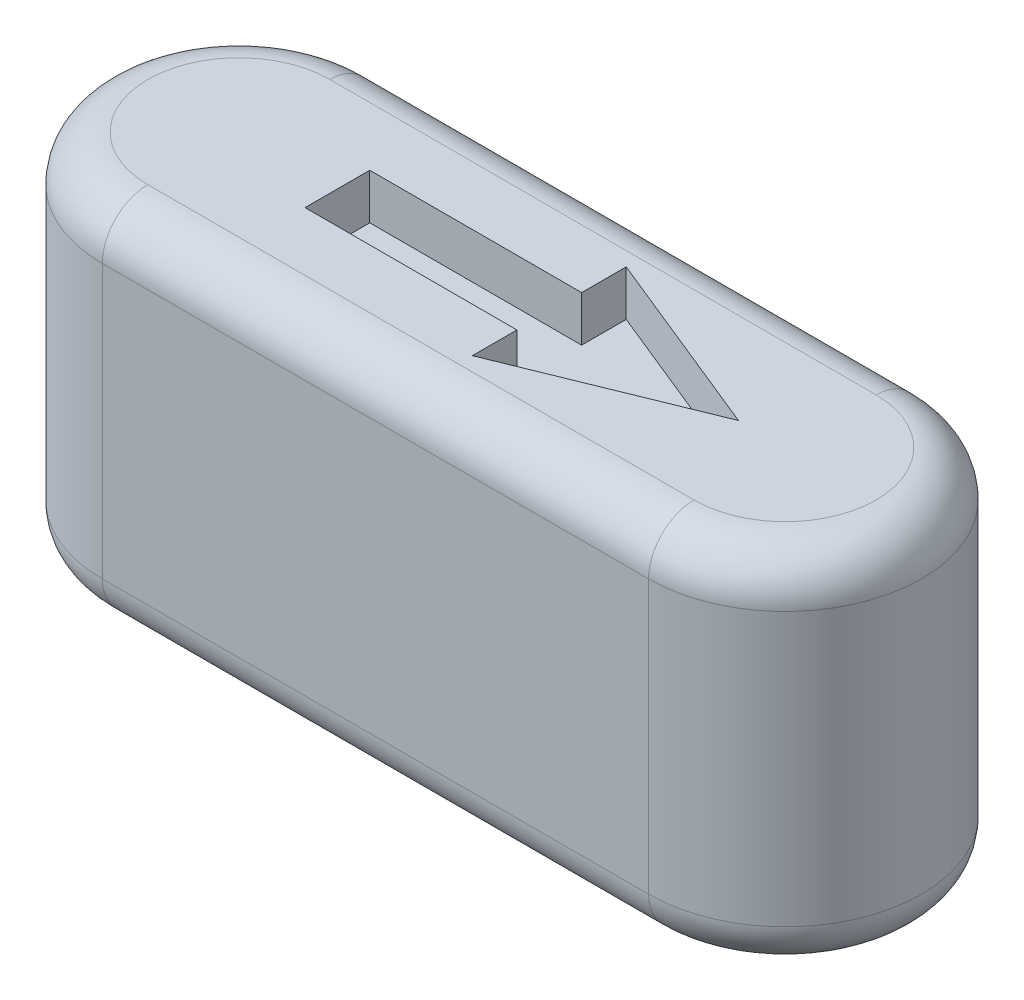
ISO-10303-21;
HEADER;
FILE_DESCRIPTION(('STEP AP214'),'2;1');
FILE_NAME('part.step','',(''),(''),'','','');
FILE_SCHEMA(('AUTOMOTIVE_DESIGN { 1 0 10303 214 1 1 1 1 }'));
ENDSEC;
DATA;
#1=APPLICATION_CONTEXT('core data for automotive mechanical design processes');
#2=APPLICATION_PROTOCOL_DEFINITION('international standard','automotive_design',2000,#1);
#3=PRODUCT_CONTEXT('',#1,'mechanical');
#4=PRODUCT('Part','Part','',(#3));
#5=PRODUCT_RELATED_PRODUCT_CATEGORY('part','',(#4));
#6=PRODUCT_DEFINITION_FORMATION('','',#4);
#7=PRODUCT_DEFINITION_CONTEXT('part definition',#1,'design');
#8=PRODUCT_DEFINITION('design','',#6,#7);
#9=PRODUCT_DEFINITION_SHAPE('','',#8);
#10=(LENGTH_UNIT() NAMED_UNIT(*) SI_UNIT(.MILLI.,.METRE.));
#11=(NAMED_UNIT(*) PLANE_ANGLE_UNIT() SI_UNIT($,.RADIAN.));
#12=(NAMED_UNIT(*) SI_UNIT($,.STERADIAN.) SOLID_ANGLE_UNIT());
#13=UNCERTAINTY_MEASURE_WITH_UNIT(LENGTH_MEASURE(1.E-05),#10,'distance_accuracy_value','');
#14=(GEOMETRIC_REPRESENTATION_CONTEXT(3) GLOBAL_UNCERTAINTY_ASSIGNED_CONTEXT((#13)) GLOBAL_UNIT_ASSIGNED_CONTEXT((#10,
#11,#12)) REPRESENTATION_CONTEXT('',''));
#15=CARTESIAN_POINT('',(0.,0.,0.));
#16=DIRECTION('',(0.,0.,1.));
#17=DIRECTION('',(1.,0.,0.));
#18=AXIS2_PLACEMENT_3D('',#15,#16,#17);
#19=CARTESIAN_POINT('',(0.,10.16,0.));
#20=DIRECTION('',(0.,-1.,0.));
#21=DIRECTION('',(0.,0.,-1.));
#22=AXIS2_PLACEMENT_3D('',#19,#20,#21);
#23=CYLINDRICAL_SURFACE('',#22,3.81);
#24=DIRECTION('',(0.,-1.,0.));
#25=VECTOR('',#24,1.);
#26=CARTESIAN_POINT('',(0.,10.16,-3.81));
#27=LINE('',#26,#25);
#28=CARTESIAN_POINT('',(0.,8.89,-3.81));
#29=VERTEX_POINT('',#28);
#30=CARTESIAN_POINT('',(0.,1.27,-3.81));
#31=VERTEX_POINT('',#30);
#32=EDGE_CURVE('E201',#29,#31,#27,.T.);
#33=ORIENTED_EDGE('',*,*,#32,.T.);
#34=CARTESIAN_POINT('',(0.,1.27,0.));
#35=DIRECTION('',(0.,1.,0.));
#36=DIRECTION('',(0.,0.,1.));
#37=AXIS2_PLACEMENT_3D('',#34,#35,#36);
#38=CIRCLE('',#37,3.81);
#39=CARTESIAN_POINT('',(0.,1.27,3.81));
#40=VERTEX_POINT('',#39);
#41=EDGE_CURVE('E55',#31,#40,#38,.T.);
#42=ORIENTED_EDGE('',*,*,#41,.T.);
#43=DIRECTION('',(0.,-1.,0.));
#44=VECTOR('',#43,1.);
#45=CARTESIAN_POINT('',(0.,10.16,3.81));
#46=LINE('',#45,#44);
#47=CARTESIAN_POINT('',(0.,8.89,3.81));
#48=VERTEX_POINT('',#47);
#49=EDGE_CURVE('E217',#48,#40,#46,.T.);
#50=ORIENTED_EDGE('',*,*,#49,.F.);
#51=CARTESIAN_POINT('',(0.,8.89,0.));
#52=DIRECTION('',(0.,1.,0.));
#53=DIRECTION('',(0.,0.,1.));
#54=AXIS2_PLACEMENT_3D('',#51,#52,#53);
#55=CIRCLE('',#54,3.81);
#56=EDGE_CURVE('E233',#48,#29,#55,.F.);
#57=ORIENTED_EDGE('',*,*,#56,.T.);
#58=EDGE_LOOP('',(#33,#42,#50,#57));
#59=FACE_BOUND('',#58,.T.);
#60=ADVANCED_FACE('F33',(#59),#23,.T.);
#61=CARTESIAN_POINT('',(0.,10.16,3.81));
#62=DIRECTION('',(0.,0.,-1.));
#63=DIRECTION('',(-1.,0.,0.));
#64=AXIS2_PLACEMENT_3D('',#61,#62,#63);
#65=PLANE('',#64);
#66=ORIENTED_EDGE('',*,*,#49,.T.);
#67=DIRECTION('',(1.,0.,0.));
#68=VECTOR('',#67,1.);
#69=CARTESIAN_POINT('',(0.,1.27,3.81));
#70=LINE('',#69,#68);
#71=CARTESIAN_POINT('',(15.24,1.27,3.81));
#72=VERTEX_POINT('',#71);
#73=EDGE_CURVE('E42',#40,#72,#70,.T.);
#74=ORIENTED_EDGE('',*,*,#73,.T.);
#75=DIRECTION('',(0.,-1.,0.));
#76=VECTOR('',#75,1.);
#77=CARTESIAN_POINT('',(15.24,10.16,3.81));
#78=LINE('',#77,#76);
#79=CARTESIAN_POINT('',(15.24,8.89,3.81));
#80=VERTEX_POINT('',#79);
#81=EDGE_CURVE('E214',#80,#72,#78,.T.);
#82=ORIENTED_EDGE('',*,*,#81,.F.);
#83=DIRECTION('',(1.,0.,0.));
#84=VECTOR('',#83,1.);
#85=CARTESIAN_POINT('',(0.,8.89,3.81));
#86=LINE('',#85,#84);
#87=EDGE_CURVE('E231',#80,#48,#86,.F.);
#88=ORIENTED_EDGE('',*,*,#87,.T.);
#89=EDGE_LOOP('',(#66,#74,#82,#88));
#90=FACE_BOUND('',#89,.T.);
#91=ADVANCED_FACE('F303',(#90),#65,.F.);
#92=CARTESIAN_POINT('',(15.24,10.16,0.));
#93=DIRECTION('',(0.,-1.,0.));
#94=DIRECTION('',(0.,0.,-1.));
#95=AXIS2_PLACEMENT_3D('',#92,#93,#94);
#96=CYLINDRICAL_SURFACE('',#95,3.81);
#97=ORIENTED_EDGE('',*,*,#81,.T.);
#98=CARTESIAN_POINT('',(15.24,1.27,0.));
#99=DIRECTION('',(0.,1.,0.));
#100=DIRECTION('',(0.,0.,1.));
#101=AXIS2_PLACEMENT_3D('',#98,#99,#100);
#102=CIRCLE('',#101,3.81);
#103=CARTESIAN_POINT('',(15.24,1.27,-3.81));
#104=VERTEX_POINT('',#103);
#105=EDGE_CURVE('E237',#72,#104,#102,.T.);
#106=ORIENTED_EDGE('',*,*,#105,.T.);
#107=DIRECTION('',(0.,-1.,0.));
#108=VECTOR('',#107,1.);
#109=CARTESIAN_POINT('',(15.24,10.16,-3.81));
#110=LINE('',#109,#108);
#111=CARTESIAN_POINT('',(15.24,8.89,-3.81));
#112=VERTEX_POINT('',#111);
#113=EDGE_CURVE('E212',#112,#104,#110,.T.);
#114=ORIENTED_EDGE('',*,*,#113,.F.);
#115=CARTESIAN_POINT('',(15.24,8.89,0.));
#116=DIRECTION('',(0.,1.,0.));
#117=DIRECTION('',(0.,0.,1.));
#118=AXIS2_PLACEMENT_3D('',#115,#116,#117);
#119=CIRCLE('',#118,3.81);
#120=EDGE_CURVE('E228',#112,#80,#119,.F.);
#121=ORIENTED_EDGE('',*,*,#120,.T.);
#122=EDGE_LOOP('',(#97,#106,#114,#121));
#123=FACE_BOUND('',#122,.T.);
#124=ADVANCED_FACE('F287',(#123),#96,.T.);
#125=CARTESIAN_POINT('',(0.,10.16,-3.81));
#126=DIRECTION('',(0.,0.,1.));
#127=DIRECTION('',(1.,0.,0.));
#128=AXIS2_PLACEMENT_3D('',#125,#126,#127);
#129=PLANE('',#128);
#130=ORIENTED_EDGE('',*,*,#113,.T.);
#131=DIRECTION('',(-1.,0.,0.));
#132=VECTOR('',#131,1.);
#133=CARTESIAN_POINT('',(0.,1.27,-3.81));
#134=LINE('',#133,#132);
#135=EDGE_CURVE('E11',#104,#31,#134,.T.);
#136=ORIENTED_EDGE('',*,*,#135,.T.);
#137=ORIENTED_EDGE('',*,*,#32,.F.);
#138=DIRECTION('',(-1.,0.,0.));
#139=VECTOR('',#138,1.);
#140=CARTESIAN_POINT('',(15.24,8.89,-3.81));
#141=LINE('',#140,#139);
#142=EDGE_CURVE('E235',#29,#112,#141,.F.);
#143=ORIENTED_EDGE('',*,*,#142,.T.);
#144=EDGE_LOOP('',(#130,#136,#137,#143));
#145=FACE_BOUND('',#144,.T.);
#146=ADVANCED_FACE('F290',(#145),#129,.F.);
#147=CARTESIAN_POINT('',(0.,10.16,0.));
#148=DIRECTION('',(0.,1.,0.));
#149=DIRECTION('',(0.,0.,1.));
#150=AXIS2_PLACEMENT_3D('',#147,#148,#149);
#151=PLANE('',#150);
#152=DIRECTION('',(1.,0.,0.));
#153=VECTOR('',#152,1.);
#154=CARTESIAN_POINT('',(15.24,10.16,2.54));
#155=LINE('',#154,#153);
#156=CARTESIAN_POINT('',(0.,10.16,2.54));
#157=VERTEX_POINT('',#156);
#158=CARTESIAN_POINT('',(15.24,10.16,2.54));
#159=VERTEX_POINT('',#158);
#160=EDGE_CURVE('E223',#157,#159,#155,.T.);
#161=ORIENTED_EDGE('',*,*,#160,.T.);
#162=CARTESIAN_POINT('',(15.24,10.16,0.));
#163=DIRECTION('',(0.,1.,0.));
#164=DIRECTION('',(0.,0.,1.));
#165=AXIS2_PLACEMENT_3D('',#162,#163,#164);
#166=CIRCLE('',#165,2.54);
#167=CARTESIAN_POINT('',(15.24,10.16,-2.54));
#168=VERTEX_POINT('',#167);
#169=EDGE_CURVE('E225',#159,#168,#166,.T.);
#170=ORIENTED_EDGE('',*,*,#169,.T.);
#171=DIRECTION('',(-1.,0.,0.));
#172=VECTOR('',#171,1.);
#173=CARTESIAN_POINT('',(0.,10.16,-2.54));
#174=LINE('',#173,#172);
#175=CARTESIAN_POINT('',(0.,10.16,-2.54));
#176=VERTEX_POINT('',#175);
#177=EDGE_CURVE('E219',#168,#176,#174,.T.);
#178=ORIENTED_EDGE('',*,*,#177,.T.);
#179=CARTESIAN_POINT('',(0.,10.16,0.));
#180=DIRECTION('',(0.,1.,0.));
#181=DIRECTION('',(0.,0.,1.));
#182=AXIS2_PLACEMENT_3D('',#179,#180,#181);
#183=CIRCLE('',#182,2.54);
#184=EDGE_CURVE('E221',#176,#157,#183,.T.);
#185=ORIENTED_EDGE('',*,*,#184,.T.);
#186=EDGE_LOOP('',(#161,#170,#178,#185));
#187=FACE_BOUND('',#186,.T.);
#188=DIRECTION('',(0.,0.,1.));
#189=VECTOR('',#188,1.);
#190=CARTESIAN_POINT('',(8.66019784488038,10.16,0.902510302258476));
#191=LINE('',#190,#189);
#192=CARTESIAN_POINT('',(8.66019784488038,10.16,0.902510302258476));
#193=VERTEX_POINT('',#192);
#194=CARTESIAN_POINT('',(8.66019784488038,10.16,2.14567358028624));
#195=VERTEX_POINT('',#194);
#196=EDGE_CURVE('E150',#193,#195,#191,.T.);
#197=ORIENTED_EDGE('',*,*,#196,.F.);
#198=DIRECTION('',(1.,0.,0.));
#199=VECTOR('',#198,1.);
#200=CARTESIAN_POINT('',(2.74882960446263,10.16,0.902510302258476));
#201=LINE('',#200,#199);
#202=CARTESIAN_POINT('',(2.74882960446263,10.16,0.902510302258476));
#203=VERTEX_POINT('',#202);
#204=EDGE_CURVE('E168',#203,#193,#201,.T.);
#205=ORIENTED_EDGE('',*,*,#204,.F.);
#206=DIRECTION('',(0.,0.,1.));
#207=VECTOR('',#206,1.);
#208=CARTESIAN_POINT('',(2.74882960446263,10.16,0.902510302258476));
#209=LINE('',#208,#207);
#210=CARTESIAN_POINT('',(2.74882960446263,10.16,-0.902510302258476));
#211=VERTEX_POINT('',#210);
#212=EDGE_CURVE('E171',#211,#203,#209,.T.);
#213=ORIENTED_EDGE('',*,*,#212,.F.);
#214=DIRECTION('',(-1.,0.,0.));
#215=VECTOR('',#214,1.);
#216=CARTESIAN_POINT('',(2.74882960446263,10.16,-0.902510302258476));
#217=LINE('',#216,#215);
#218=CARTESIAN_POINT('',(8.66019784488038,10.16,-0.902510302258476));
#219=VERTEX_POINT('',#218);
#220=EDGE_CURVE('E194',#219,#211,#217,.T.);
#221=ORIENTED_EDGE('',*,*,#220,.F.);
#222=DIRECTION('',(0.,0.,1.));
#223=VECTOR('',#222,1.);
#224=CARTESIAN_POINT('',(8.66019784488038,10.16,-0.902510302258476));
#225=LINE('',#224,#223);
#226=CARTESIAN_POINT('',(8.66019784488038,10.16,-2.14567358028624));
#227=VERTEX_POINT('',#226);
#228=EDGE_CURVE('E191',#227,#219,#225,.T.);
#229=ORIENTED_EDGE('',*,*,#228,.F.);
#230=DIRECTION('',(-0.926353220579742,0.,-0.376655958032712));
#231=VECTOR('',#230,1.);
#232=CARTESIAN_POINT('',(8.66019784488038,10.16,-2.14567358028624));
#233=LINE('',#232,#231);
#234=CARTESIAN_POINT('',(13.9372991067125,10.16,0.));
#235=VERTEX_POINT('',#234);
#236=EDGE_CURVE('E188',#235,#227,#233,.T.);
#237=ORIENTED_EDGE('',*,*,#236,.F.);
#238=DIRECTION('',(0.926353220579741,0.,-0.376655958032713));
#239=VECTOR('',#238,1.);
#240=CARTESIAN_POINT('',(8.66019784488038,10.16,2.14567358028624));
#241=LINE('',#240,#239);
#242=EDGE_CURVE('E185',#195,#235,#241,.T.);
#243=ORIENTED_EDGE('',*,*,#242,.F.);
#244=EDGE_LOOP('',(#197,#205,#213,#221,#229,#237,#243));
#245=FACE_BOUND('',#244,.T.);
#246=ADVANCED_FACE('F313',(#187,#245),#151,.T.);
#247=CARTESIAN_POINT('',(0.,0.,0.));
#248=DIRECTION('',(0.,1.,0.));
#249=DIRECTION('',(0.,0.,1.));
#250=AXIS2_PLACEMENT_3D('',#247,#248,#249);
#251=PLANE('',#250);
#252=CARTESIAN_POINT('',(15.24,0.,0.));
#253=DIRECTION('',(0.,1.,0.));
#254=DIRECTION('',(0.,0.,1.));
#255=AXIS2_PLACEMENT_3D('',#252,#253,#254);
#256=CIRCLE('',#255,2.54);
#257=CARTESIAN_POINT('',(15.24,0.,-2.54));
#258=VERTEX_POINT('',#257);
#259=CARTESIAN_POINT('',(15.24,0.,2.54));
#260=VERTEX_POINT('',#259);
#261=EDGE_CURVE('E253',#258,#260,#256,.F.);
#262=ORIENTED_EDGE('',*,*,#261,.T.);
#263=DIRECTION('',(1.,0.,0.));
#264=VECTOR('',#263,1.);
#265=CARTESIAN_POINT('',(0.,0.,2.54));
#266=LINE('',#265,#264);
#267=CARTESIAN_POINT('',(0.,0.,2.54));
#268=VERTEX_POINT('',#267);
#269=EDGE_CURVE('E256',#260,#268,#266,.F.);
#270=ORIENTED_EDGE('',*,*,#269,.T.);
#271=CARTESIAN_POINT('',(0.,0.,0.));
#272=DIRECTION('',(0.,1.,0.));
#273=DIRECTION('',(0.,0.,1.));
#274=AXIS2_PLACEMENT_3D('',#271,#272,#273);
#275=CIRCLE('',#274,2.54);
#276=CARTESIAN_POINT('',(0.,0.,-2.54));
#277=VERTEX_POINT('',#276);
#278=EDGE_CURVE('E251',#268,#277,#275,.F.);
#279=ORIENTED_EDGE('',*,*,#278,.T.);
#280=DIRECTION('',(-1.,0.,0.));
#281=VECTOR('',#280,1.);
#282=CARTESIAN_POINT('',(0.,0.,-2.54));
#283=LINE('',#282,#281);
#284=EDGE_CURVE('E249',#277,#258,#283,.F.);
#285=ORIENTED_EDGE('',*,*,#284,.T.);
#286=EDGE_LOOP('',(#262,#270,#279,#285));
#287=FACE_BOUND('',#286,.T.);
#288=ADVANCED_FACE('F278',(#287),#251,.F.);
#289=CARTESIAN_POINT('',(8.66019784488038,8.89,0.902510302258476));
#290=DIRECTION('',(-1.,0.,0.));
#291=DIRECTION('',(0.,0.,1.));
#292=AXIS2_PLACEMENT_3D('',#289,#290,#291);
#293=PLANE('',#292);
#294=ORIENTED_EDGE('',*,*,#196,.T.);
#295=DIRECTION('',(0.,1.,0.));
#296=VECTOR('',#295,1.);
#297=CARTESIAN_POINT('',(8.66019784488038,8.89,2.14567358028624));
#298=LINE('',#297,#296);
#299=CARTESIAN_POINT('',(8.66019784488038,8.89,2.14567358028624));
#300=VERTEX_POINT('',#299);
#301=EDGE_CURVE('E143',#300,#195,#298,.T.);
#302=ORIENTED_EDGE('',*,*,#301,.F.);
#303=DIRECTION('',(0.,0.,1.));
#304=VECTOR('',#303,1.);
#305=CARTESIAN_POINT('',(8.66019784488038,8.89,0.902510302258476));
#306=LINE('',#305,#304);
#307=CARTESIAN_POINT('',(8.66019784488038,8.89,0.902510302258476));
#308=VERTEX_POINT('',#307);
#309=EDGE_CURVE('E147',#308,#300,#306,.T.);
#310=ORIENTED_EDGE('',*,*,#309,.F.);
#311=DIRECTION('',(0.,1.,0.));
#312=VECTOR('',#311,1.);
#313=CARTESIAN_POINT('',(8.66019784488038,8.89,0.902510302258476));
#314=LINE('',#313,#312);
#315=EDGE_CURVE('E199',#308,#193,#314,.T.);
#316=ORIENTED_EDGE('',*,*,#315,.T.);
#317=EDGE_LOOP('',(#294,#302,#310,#316));
#318=FACE_BOUND('',#317,.T.);
#319=ADVANCED_FACE('F145',(#318),#293,.F.);
#320=CARTESIAN_POINT('',(2.74882960446263,8.89,0.902510302258476));
#321=DIRECTION('',(0.,0.,1.));
#322=DIRECTION('',(1.,0.,0.));
#323=AXIS2_PLACEMENT_3D('',#320,#321,#322);
#324=PLANE('',#323);
#325=ORIENTED_EDGE('',*,*,#204,.T.);
#326=ORIENTED_EDGE('',*,*,#315,.F.);
#327=DIRECTION('',(1.,0.,0.));
#328=VECTOR('',#327,1.);
#329=CARTESIAN_POINT('',(2.74882960446263,8.89,0.902510302258476));
#330=LINE('',#329,#328);
#331=CARTESIAN_POINT('',(2.74882960446263,8.89,0.902510302258476));
#332=VERTEX_POINT('',#331);
#333=EDGE_CURVE('E155',#332,#308,#330,.T.);
#334=ORIENTED_EDGE('',*,*,#333,.F.);
#335=DIRECTION('',(0.,1.,0.));
#336=VECTOR('',#335,1.);
#337=CARTESIAN_POINT('',(2.74882960446263,8.89,0.902510302258476));
#338=LINE('',#337,#336);
#339=EDGE_CURVE('E202',#332,#203,#338,.T.);
#340=ORIENTED_EDGE('',*,*,#339,.T.);
#341=EDGE_LOOP('',(#325,#326,#334,#340));
#342=FACE_BOUND('',#341,.T.);
#343=ADVANCED_FACE('F334',(#342),#324,.F.);
#344=CARTESIAN_POINT('',(2.74882960446263,8.89,0.902510302258476));
#345=DIRECTION('',(-1.,0.,0.));
#346=DIRECTION('',(0.,0.,1.));
#347=AXIS2_PLACEMENT_3D('',#344,#345,#346);
#348=PLANE('',#347);
#349=ORIENTED_EDGE('',*,*,#212,.T.);
#350=ORIENTED_EDGE('',*,*,#339,.F.);
#351=DIRECTION('',(0.,0.,1.));
#352=VECTOR('',#351,1.);
#353=CARTESIAN_POINT('',(2.74882960446263,8.89,0.902510302258476));
#354=LINE('',#353,#352);
#355=CARTESIAN_POINT('',(2.74882960446263,8.89,-0.902510302258476));
#356=VERTEX_POINT('',#355);
#357=EDGE_CURVE('E181',#356,#332,#354,.T.);
#358=ORIENTED_EDGE('',*,*,#357,.F.);
#359=DIRECTION('',(0.,1.,0.));
#360=VECTOR('',#359,1.);
#361=CARTESIAN_POINT('',(2.74882960446263,8.89,-0.902510302258476));
#362=LINE('',#361,#360);
#363=EDGE_CURVE('E204',#356,#211,#362,.T.);
#364=ORIENTED_EDGE('',*,*,#363,.T.);
#365=EDGE_LOOP('',(#349,#350,#358,#364));
#366=FACE_BOUND('',#365,.T.);
#367=ADVANCED_FACE('F332',(#366),#348,.F.);
#368=CARTESIAN_POINT('',(2.74882960446263,8.89,-0.902510302258476));
#369=DIRECTION('',(0.,0.,-1.));
#370=DIRECTION('',(-1.,0.,0.));
#371=AXIS2_PLACEMENT_3D('',#368,#369,#370);
#372=PLANE('',#371);
#373=ORIENTED_EDGE('',*,*,#220,.T.);
#374=ORIENTED_EDGE('',*,*,#363,.F.);
#375=DIRECTION('',(-1.,0.,0.));
#376=VECTOR('',#375,1.);
#377=CARTESIAN_POINT('',(2.74882960446263,8.89,-0.902510302258476));
#378=LINE('',#377,#376);
#379=CARTESIAN_POINT('',(8.66019784488038,8.89,-0.902510302258476));
#380=VERTEX_POINT('',#379);
#381=EDGE_CURVE('E178',#380,#356,#378,.T.);
#382=ORIENTED_EDGE('',*,*,#381,.F.);
#383=DIRECTION('',(0.,1.,0.));
#384=VECTOR('',#383,1.);
#385=CARTESIAN_POINT('',(8.66019784488038,8.89,-0.902510302258476));
#386=LINE('',#385,#384);
#387=EDGE_CURVE('E206',#380,#219,#386,.T.);
#388=ORIENTED_EDGE('',*,*,#387,.T.);
#389=EDGE_LOOP('',(#373,#374,#382,#388));
#390=FACE_BOUND('',#389,.T.);
#391=ADVANCED_FACE('F329',(#390),#372,.F.);
#392=CARTESIAN_POINT('',(8.66019784488038,8.89,-0.902510302258476));
#393=DIRECTION('',(-1.,0.,0.));
#394=DIRECTION('',(0.,0.,1.));
#395=AXIS2_PLACEMENT_3D('',#392,#393,#394);
#396=PLANE('',#395);
#397=ORIENTED_EDGE('',*,*,#228,.T.);
#398=ORIENTED_EDGE('',*,*,#387,.F.);
#399=DIRECTION('',(0.,0.,1.));
#400=VECTOR('',#399,1.);
#401=CARTESIAN_POINT('',(8.66019784488038,8.89,-0.902510302258476));
#402=LINE('',#401,#400);
#403=CARTESIAN_POINT('',(8.66019784488038,8.89,-2.14567358028624));
#404=VERTEX_POINT('',#403);
#405=EDGE_CURVE('E175',#404,#380,#402,.T.);
#406=ORIENTED_EDGE('',*,*,#405,.F.);
#407=DIRECTION('',(0.,1.,0.));
#408=VECTOR('',#407,1.);
#409=CARTESIAN_POINT('',(8.66019784488038,8.89,-2.14567358028624));
#410=LINE('',#409,#408);
#411=EDGE_CURVE('E208',#404,#227,#410,.T.);
#412=ORIENTED_EDGE('',*,*,#411,.T.);
#413=EDGE_LOOP('',(#397,#398,#406,#412));
#414=FACE_BOUND('',#413,.T.);
#415=ADVANCED_FACE('F327',(#414),#396,.F.);
#416=CARTESIAN_POINT('',(8.66019784488038,8.89,-2.14567358028624));
#417=DIRECTION('',(0.376655958032712,0.,-0.926353220579742));
#418=DIRECTION('',(-0.926353220579742,0.,-0.376655958032712));
#419=AXIS2_PLACEMENT_3D('',#416,#417,#418);
#420=PLANE('',#419);
#421=ORIENTED_EDGE('',*,*,#236,.T.);
#422=ORIENTED_EDGE('',*,*,#411,.F.);
#423=DIRECTION('',(-0.926353220579742,0.,-0.376655958032712));
#424=VECTOR('',#423,1.);
#425=CARTESIAN_POINT('',(8.66019784488038,8.89,-2.14567358028624));
#426=LINE('',#425,#424);
#427=CARTESIAN_POINT('',(13.9372991067125,8.89,0.));
#428=VERTEX_POINT('',#427);
#429=EDGE_CURVE('E163',#428,#404,#426,.T.);
#430=ORIENTED_EDGE('',*,*,#429,.F.);
#431=DIRECTION('',(0.,1.,0.));
#432=VECTOR('',#431,1.);
#433=CARTESIAN_POINT('',(13.9372991067125,8.89,0.));
#434=LINE('',#433,#432);
#435=EDGE_CURVE('E154',#428,#235,#434,.T.);
#436=ORIENTED_EDGE('',*,*,#435,.T.);
#437=EDGE_LOOP('',(#421,#422,#430,#436));
#438=FACE_BOUND('',#437,.T.);
#439=ADVANCED_FACE('F323',(#438),#420,.F.);
#440=CARTESIAN_POINT('',(8.66019784488038,8.89,2.14567358028624));
#441=DIRECTION('',(0.376655958032713,0.,0.926353220579742));
#442=DIRECTION('',(0.926353220579742,0.,-0.376655958032713));
#443=AXIS2_PLACEMENT_3D('',#440,#441,#442);
#444=PLANE('',#443);
#445=ORIENTED_EDGE('',*,*,#242,.T.);
#446=ORIENTED_EDGE('',*,*,#435,.F.);
#447=DIRECTION('',(0.926353220579741,0.,-0.376655958032713));
#448=VECTOR('',#447,1.);
#449=CARTESIAN_POINT('',(8.66019784488038,8.89,2.14567358028624));
#450=LINE('',#449,#448);
#451=EDGE_CURVE('E158',#300,#428,#450,.T.);
#452=ORIENTED_EDGE('',*,*,#451,.F.);
#453=ORIENTED_EDGE('',*,*,#301,.T.);
#454=EDGE_LOOP('',(#445,#446,#452,#453));
#455=FACE_BOUND('',#454,.T.);
#456=ADVANCED_FACE('F159',(#455),#444,.F.);
#457=CARTESIAN_POINT('',(0.,8.89,0.));
#458=DIRECTION('',(0.,1.,0.));
#459=DIRECTION('',(0.,0.,1.));
#460=AXIS2_PLACEMENT_3D('',#457,#458,#459);
#461=PLANE('',#460);
#462=ORIENTED_EDGE('',*,*,#309,.T.);
#463=ORIENTED_EDGE('',*,*,#451,.T.);
#464=ORIENTED_EDGE('',*,*,#429,.T.);
#465=ORIENTED_EDGE('',*,*,#405,.T.);
#466=ORIENTED_EDGE('',*,*,#381,.T.);
#467=ORIENTED_EDGE('',*,*,#357,.T.);
#468=ORIENTED_EDGE('',*,*,#333,.T.);
#469=EDGE_LOOP('',(#462,#463,#464,#465,#466,#467,#468));
#470=FACE_BOUND('',#469,.T.);
#471=ADVANCED_FACE('F165',(#470),#461,.T.);
#472=CARTESIAN_POINT('',(0.,8.89,0.));
#473=DIRECTION('',(0.,1.,0.));
#474=DIRECTION('',(0.,0.,1.));
#475=AXIS2_PLACEMENT_3D('',#472,#473,#474);
#476=TOROIDAL_SURFACE('',#475,2.54,1.27);
#477=CARTESIAN_POINT('',(0.,8.89,-2.54));
#478=DIRECTION('',(1.,0.,0.));
#479=DIRECTION('',(0.,0.,-1.));
#480=AXIS2_PLACEMENT_3D('',#477,#478,#479);
#481=CIRCLE('',#480,1.27);
#482=EDGE_CURVE('E242',#29,#176,#481,.T.);
#483=ORIENTED_EDGE('',*,*,#482,.F.);
#484=ORIENTED_EDGE('',*,*,#56,.F.);
#485=CARTESIAN_POINT('',(0.,8.89,2.54));
#486=DIRECTION('',(1.,0.,0.));
#487=DIRECTION('',(0.,0.,-1.));
#488=AXIS2_PLACEMENT_3D('',#485,#486,#487);
#489=CIRCLE('',#488,1.27);
#490=EDGE_CURVE('E186',#157,#48,#489,.T.);
#491=ORIENTED_EDGE('',*,*,#490,.F.);
#492=ORIENTED_EDGE('',*,*,#184,.F.);
#493=EDGE_LOOP('',(#483,#484,#491,#492));
#494=FACE_BOUND('',#493,.T.);
#495=ADVANCED_FACE('F307',(#494),#476,.T.);
#496=CARTESIAN_POINT('',(0.,8.89,2.54));
#497=DIRECTION('',(-1.,0.,0.));
#498=DIRECTION('',(0.,0.,1.));
#499=AXIS2_PLACEMENT_3D('',#496,#497,#498);
#500=CYLINDRICAL_SURFACE('',#499,1.27);
#501=ORIENTED_EDGE('',*,*,#490,.T.);
#502=ORIENTED_EDGE('',*,*,#87,.F.);
#503=CARTESIAN_POINT('',(15.24,8.89,2.54));
#504=DIRECTION('',(1.,0.,0.));
#505=DIRECTION('',(0.,0.,-1.));
#506=AXIS2_PLACEMENT_3D('',#503,#504,#505);
#507=CIRCLE('',#506,1.27);
#508=EDGE_CURVE('E240',#159,#80,#507,.T.);
#509=ORIENTED_EDGE('',*,*,#508,.F.);
#510=ORIENTED_EDGE('',*,*,#160,.F.);
#511=EDGE_LOOP('',(#501,#502,#509,#510));
#512=FACE_BOUND('',#511,.T.);
#513=ADVANCED_FACE('F311',(#512),#500,.T.);
#514=CARTESIAN_POINT('',(0.,8.89,-2.54));
#515=DIRECTION('',(1.,0.,0.));
#516=DIRECTION('',(0.,0.,-1.));
#517=AXIS2_PLACEMENT_3D('',#514,#515,#516);
#518=CYLINDRICAL_SURFACE('',#517,1.27);
#519=ORIENTED_EDGE('',*,*,#482,.T.);
#520=ORIENTED_EDGE('',*,*,#177,.F.);
#521=CARTESIAN_POINT('',(15.24,8.89,-2.54));
#522=DIRECTION('',(1.,0.,0.));
#523=DIRECTION('',(0.,0.,-1.));
#524=AXIS2_PLACEMENT_3D('',#521,#522,#523);
#525=CIRCLE('',#524,1.27);
#526=EDGE_CURVE('E238',#112,#168,#525,.T.);
#527=ORIENTED_EDGE('',*,*,#526,.F.);
#528=ORIENTED_EDGE('',*,*,#142,.F.);
#529=EDGE_LOOP('',(#519,#520,#527,#528));
#530=FACE_BOUND('',#529,.T.);
#531=ADVANCED_FACE('F295',(#530),#518,.T.);
#532=CARTESIAN_POINT('',(15.24,8.89,0.));
#533=DIRECTION('',(0.,1.,0.));
#534=DIRECTION('',(0.,0.,1.));
#535=AXIS2_PLACEMENT_3D('',#532,#533,#534);
#536=TOROIDAL_SURFACE('',#535,2.54,1.27);
#537=ORIENTED_EDGE('',*,*,#508,.T.);
#538=ORIENTED_EDGE('',*,*,#120,.F.);
#539=ORIENTED_EDGE('',*,*,#526,.T.);
#540=ORIENTED_EDGE('',*,*,#169,.F.);
#541=EDGE_LOOP('',(#537,#538,#539,#540));
#542=FACE_BOUND('',#541,.T.);
#543=ADVANCED_FACE('F299',(#542),#536,.T.);
#544=CARTESIAN_POINT('',(0.,1.27,0.));
#545=DIRECTION('',(0.,1.,0.));
#546=DIRECTION('',(0.,0.,1.));
#547=AXIS2_PLACEMENT_3D('',#544,#545,#546);
#548=TOROIDAL_SURFACE('',#547,2.54,1.27);
#549=CARTESIAN_POINT('',(0.,1.27,-2.54));
#550=DIRECTION('',(1.,0.,0.));
#551=DIRECTION('',(0.,0.,-1.));
#552=AXIS2_PLACEMENT_3D('',#549,#550,#551);
#553=CIRCLE('',#552,1.27);
#554=EDGE_CURVE('E263',#277,#31,#553,.T.);
#555=ORIENTED_EDGE('',*,*,#554,.F.);
#556=ORIENTED_EDGE('',*,*,#278,.F.);
#557=CARTESIAN_POINT('',(0.,1.27,2.54));
#558=DIRECTION('',(1.,0.,0.));
#559=DIRECTION('',(0.,0.,-1.));
#560=AXIS2_PLACEMENT_3D('',#557,#558,#559);
#561=CIRCLE('',#560,1.27);
#562=EDGE_CURVE('E37',#40,#268,#561,.T.);
#563=ORIENTED_EDGE('',*,*,#562,.F.);
#564=ORIENTED_EDGE('',*,*,#41,.F.);
#565=EDGE_LOOP('',(#555,#556,#563,#564));
#566=FACE_BOUND('',#565,.T.);
#567=ADVANCED_FACE('F35',(#566),#548,.T.);
#568=CARTESIAN_POINT('',(0.,1.27,2.54));
#569=DIRECTION('',(1.,0.,0.));
#570=DIRECTION('',(0.,0.,-1.));
#571=AXIS2_PLACEMENT_3D('',#568,#569,#570);
#572=CYLINDRICAL_SURFACE('',#571,1.27);
#573=ORIENTED_EDGE('',*,*,#562,.T.);
#574=ORIENTED_EDGE('',*,*,#269,.F.);
#575=CARTESIAN_POINT('',(15.24,1.27,2.54));
#576=DIRECTION('',(1.,0.,0.));
#577=DIRECTION('',(0.,0.,-1.));
#578=AXIS2_PLACEMENT_3D('',#575,#576,#577);
#579=CIRCLE('',#578,1.27);
#580=EDGE_CURVE('E262',#72,#260,#579,.T.);
#581=ORIENTED_EDGE('',*,*,#580,.F.);
#582=ORIENTED_EDGE('',*,*,#73,.F.);
#583=EDGE_LOOP('',(#573,#574,#581,#582));
#584=FACE_BOUND('',#583,.T.);
#585=ADVANCED_FACE('F273',(#584),#572,.T.);
#586=CARTESIAN_POINT('',(0.,1.27,-2.54));
#587=DIRECTION('',(-1.,0.,0.));
#588=DIRECTION('',(0.,0.,1.));
#589=AXIS2_PLACEMENT_3D('',#586,#587,#588);
#590=CYLINDRICAL_SURFACE('',#589,1.27);
#591=ORIENTED_EDGE('',*,*,#554,.T.);
#592=ORIENTED_EDGE('',*,*,#135,.F.);
#593=CARTESIAN_POINT('',(15.24,1.27,-2.54));
#594=DIRECTION('',(1.,0.,0.));
#595=DIRECTION('',(0.,0.,-1.));
#596=AXIS2_PLACEMENT_3D('',#593,#594,#595);
#597=CIRCLE('',#596,1.27);
#598=EDGE_CURVE('E260',#258,#104,#597,.T.);
#599=ORIENTED_EDGE('',*,*,#598,.F.);
#600=ORIENTED_EDGE('',*,*,#284,.F.);
#601=EDGE_LOOP('',(#591,#592,#599,#600));
#602=FACE_BOUND('',#601,.T.);
#603=ADVANCED_FACE('F284',(#602),#590,.T.);
#604=CARTESIAN_POINT('',(15.24,1.27,0.));
#605=DIRECTION('',(0.,1.,0.));
#606=DIRECTION('',(0.,0.,1.));
#607=AXIS2_PLACEMENT_3D('',#604,#605,#606);
#608=TOROIDAL_SURFACE('',#607,2.54,1.27);
#609=ORIENTED_EDGE('',*,*,#580,.T.);
#610=ORIENTED_EDGE('',*,*,#261,.F.);
#611=ORIENTED_EDGE('',*,*,#598,.T.);
#612=ORIENTED_EDGE('',*,*,#105,.F.);
#613=EDGE_LOOP('',(#609,#610,#611,#612));
#614=FACE_BOUND('',#613,.T.);
#615=ADVANCED_FACE('F282',(#614),#608,.T.);
#616=CLOSED_SHELL('',(#60,#91,#124,#146,#246,#288,#319,#343,#367,#391,#415,#439,#456,#471,#495,
#513,#531,#543,#567,#585,#603,#615));
#617=MANIFOLD_SOLID_BREP('B2',#616);
#618=ADVANCED_BREP_SHAPE_REPRESENTATION('',(#18,#617),#14);
#619=SHAPE_DEFINITION_REPRESENTATION(#9,#618);
ENDSEC;
END-ISO-10303-21;
